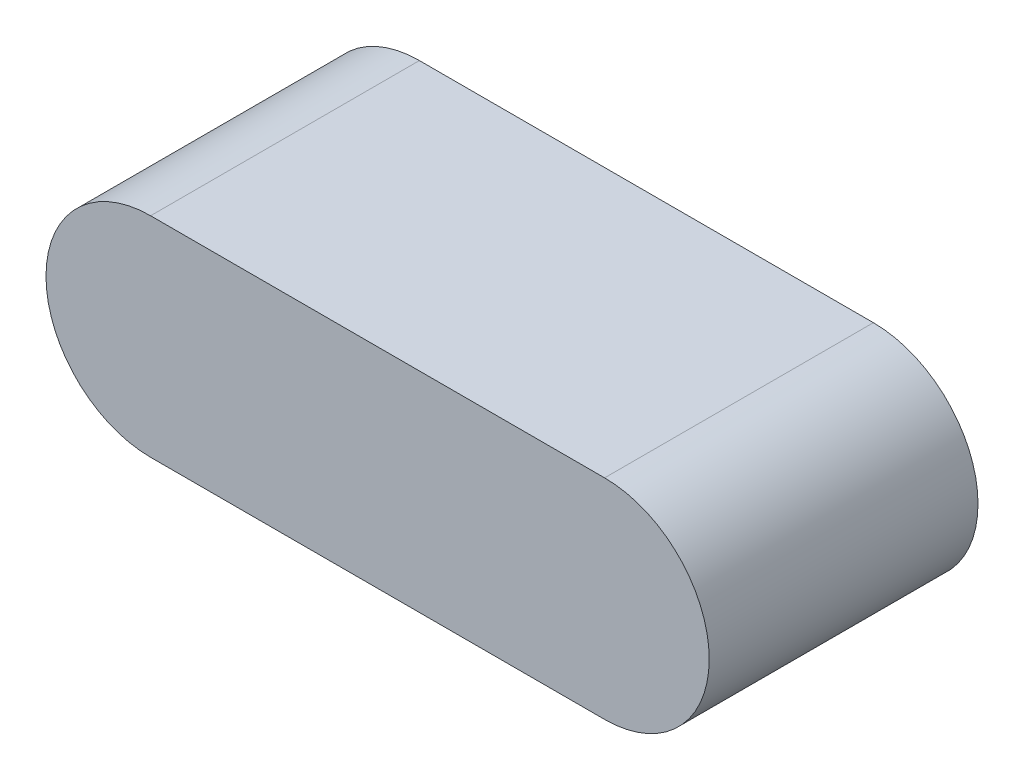
ISO-10303-21;
HEADER;
FILE_DESCRIPTION(('STEP AP214'),'2;1');
FILE_NAME('part.step','',(''),(''),'','','');
FILE_SCHEMA(('AUTOMOTIVE_DESIGN { 1 0 10303 214 1 1 1 1 }'));
ENDSEC;
DATA;
#1=APPLICATION_CONTEXT('core data for automotive mechanical design processes');
#2=APPLICATION_PROTOCOL_DEFINITION('international standard','automotive_design',2000,#1);
#3=PRODUCT_CONTEXT('',#1,'mechanical');
#4=PRODUCT('Part','Part','',(#3));
#5=PRODUCT_RELATED_PRODUCT_CATEGORY('part','',(#4));
#6=PRODUCT_DEFINITION_FORMATION('','',#4);
#7=PRODUCT_DEFINITION_CONTEXT('part definition',#1,'design');
#8=PRODUCT_DEFINITION('design','',#6,#7);
#9=PRODUCT_DEFINITION_SHAPE('','',#8);
#10=(LENGTH_UNIT() NAMED_UNIT(*) SI_UNIT(.MILLI.,.METRE.));
#11=(NAMED_UNIT(*) PLANE_ANGLE_UNIT() SI_UNIT($,.RADIAN.));
#12=(NAMED_UNIT(*) SI_UNIT($,.STERADIAN.) SOLID_ANGLE_UNIT());
#13=UNCERTAINTY_MEASURE_WITH_UNIT(LENGTH_MEASURE(1.E-05),#10,'distance_accuracy_value','');
#14=(GEOMETRIC_REPRESENTATION_CONTEXT(3) GLOBAL_UNCERTAINTY_ASSIGNED_CONTEXT((#13)) GLOBAL_UNIT_ASSIGNED_CONTEXT((#10,
#11,#12)) REPRESENTATION_CONTEXT('',''));
#15=CARTESIAN_POINT('',(0.,0.,0.));
#16=DIRECTION('',(0.,0.,1.));
#17=DIRECTION('',(1.,0.,0.));
#18=AXIS2_PLACEMENT_3D('',#15,#16,#17);
#19=CARTESIAN_POINT('',(0.,0.,0.));
#20=DIRECTION('',(0.,0.,1.));
#21=DIRECTION('',(1.,0.,0.));
#22=AXIS2_PLACEMENT_3D('',#19,#20,#21);
#23=CYLINDRICAL_SURFACE('',#22,19.4582763337893);
#24=DIRECTION('',(0.,0.,1.));
#25=VECTOR('',#24,1.);
#26=CARTESIAN_POINT('',(0.,-19.4582763337893,0.));
#27=LINE('',#26,#25);
#28=CARTESIAN_POINT('',(0.,-19.4582763337893,0.));
#29=VERTEX_POINT('',#28);
#30=CARTESIAN_POINT('',(0.,-19.4582763337893,50.));
#31=VERTEX_POINT('',#30);
#32=EDGE_CURVE('E42',#29,#31,#27,.T.);
#33=ORIENTED_EDGE('',*,*,#32,.T.);
#34=CARTESIAN_POINT('',(0.,0.,50.));
#35=DIRECTION('',(0.,0.,1.));
#36=DIRECTION('',(1.,0.,0.));
#37=AXIS2_PLACEMENT_3D('',#34,#35,#36);
#38=CIRCLE('',#37,19.4582763337893);
#39=CARTESIAN_POINT('',(0.,19.4582763337893,50.));
#40=VERTEX_POINT('',#39);
#41=EDGE_CURVE('E85',#40,#31,#38,.T.);
#42=ORIENTED_EDGE('',*,*,#41,.F.);
#43=DIRECTION('',(0.,0.,1.));
#44=VECTOR('',#43,1.);
#45=CARTESIAN_POINT('',(0.,19.4582763337893,0.));
#46=LINE('',#45,#44);
#47=CARTESIAN_POINT('',(0.,19.4582763337893,0.));
#48=VERTEX_POINT('',#47);
#49=EDGE_CURVE('E11',#48,#40,#46,.T.);
#50=ORIENTED_EDGE('',*,*,#49,.F.);
#51=CARTESIAN_POINT('',(0.,0.,0.));
#52=DIRECTION('',(0.,0.,1.));
#53=DIRECTION('',(1.,0.,0.));
#54=AXIS2_PLACEMENT_3D('',#51,#52,#53);
#55=CIRCLE('',#54,19.4582763337893);
#56=EDGE_CURVE('E102',#48,#29,#55,.T.);
#57=ORIENTED_EDGE('',*,*,#56,.T.);
#58=EDGE_LOOP('',(#33,#42,#50,#57));
#59=FACE_BOUND('',#58,.T.);
#60=ADVANCED_FACE('F39',(#59),#23,.T.);
#61=CARTESIAN_POINT('',(0.,19.4582763337893,0.));
#62=DIRECTION('',(0.,1.,0.));
#63=DIRECTION('',(0.,0.,1.));
#64=AXIS2_PLACEMENT_3D('',#61,#62,#63);
#65=PLANE('',#64);
#66=ORIENTED_EDGE('',*,*,#49,.T.);
#67=DIRECTION('',(-1.,0.,0.));
#68=VECTOR('',#67,1.);
#69=CARTESIAN_POINT('',(84.4515666731809,19.4582763337893,50.));
#70=LINE('',#69,#68);
#71=CARTESIAN_POINT('',(84.4515666731809,19.4582763337893,50.));
#72=VERTEX_POINT('',#71);
#73=EDGE_CURVE('E80',#72,#40,#70,.T.);
#74=ORIENTED_EDGE('',*,*,#73,.F.);
#75=DIRECTION('',(0.,0.,1.));
#76=VECTOR('',#75,1.);
#77=CARTESIAN_POINT('',(84.4515666731809,19.4582763337893,0.));
#78=LINE('',#77,#76);
#79=CARTESIAN_POINT('',(84.4515666731809,19.4582763337893,0.));
#80=VERTEX_POINT('',#79);
#81=EDGE_CURVE('E48',#80,#72,#78,.T.);
#82=ORIENTED_EDGE('',*,*,#81,.F.);
#83=DIRECTION('',(-1.,0.,0.));
#84=VECTOR('',#83,1.);
#85=CARTESIAN_POINT('',(0.,19.4582763337893,0.));
#86=LINE('',#85,#84);
#87=EDGE_CURVE('E83',#80,#48,#86,.T.);
#88=ORIENTED_EDGE('',*,*,#87,.T.);
#89=EDGE_LOOP('',(#66,#74,#82,#88));
#90=FACE_BOUND('',#89,.T.);
#91=ADVANCED_FACE('F78',(#90),#65,.T.);
#92=CARTESIAN_POINT('',(84.4515666731809,0.,0.));
#93=DIRECTION('',(0.,0.,1.));
#94=DIRECTION('',(1.,0.,0.));
#95=AXIS2_PLACEMENT_3D('',#92,#93,#94);
#96=CYLINDRICAL_SURFACE('',#95,19.4582763337893);
#97=ORIENTED_EDGE('',*,*,#81,.T.);
#98=CARTESIAN_POINT('',(84.4515666731809,0.,50.));
#99=DIRECTION('',(0.,0.,1.));
#100=DIRECTION('',(1.,0.,0.));
#101=AXIS2_PLACEMENT_3D('',#98,#99,#100);
#102=CIRCLE('',#101,19.4582763337893);
#103=CARTESIAN_POINT('',(84.4515666731809,-19.4582763337893,50.));
#104=VERTEX_POINT('',#103);
#105=EDGE_CURVE('E94',#104,#72,#102,.T.);
#106=ORIENTED_EDGE('',*,*,#105,.F.);
#107=DIRECTION('',(0.,0.,1.));
#108=VECTOR('',#107,1.);
#109=CARTESIAN_POINT('',(84.4515666731809,-19.4582763337893,0.));
#110=LINE('',#109,#108);
#111=CARTESIAN_POINT('',(84.4515666731809,-19.4582763337893,0.));
#112=VERTEX_POINT('',#111);
#113=EDGE_CURVE('E115',#112,#104,#110,.T.);
#114=ORIENTED_EDGE('',*,*,#113,.F.);
#115=CARTESIAN_POINT('',(84.4515666731809,0.,0.));
#116=DIRECTION('',(0.,0.,1.));
#117=DIRECTION('',(1.,0.,0.));
#118=AXIS2_PLACEMENT_3D('',#115,#116,#117);
#119=CIRCLE('',#118,19.4582763337893);
#120=EDGE_CURVE('E109',#112,#80,#119,.T.);
#121=ORIENTED_EDGE('',*,*,#120,.T.);
#122=EDGE_LOOP('',(#97,#106,#114,#121));
#123=FACE_BOUND('',#122,.T.);
#124=ADVANCED_FACE('F123',(#123),#96,.T.);
#125=CARTESIAN_POINT('',(0.,-19.4582763337893,0.));
#126=DIRECTION('',(0.,-1.,0.));
#127=DIRECTION('',(0.,0.,-1.));
#128=AXIS2_PLACEMENT_3D('',#125,#126,#127);
#129=PLANE('',#128);
#130=ORIENTED_EDGE('',*,*,#113,.T.);
#131=DIRECTION('',(1.,0.,0.));
#132=VECTOR('',#131,1.);
#133=CARTESIAN_POINT('',(0.,-19.4582763337893,50.));
#134=LINE('',#133,#132);
#135=EDGE_CURVE('E90',#31,#104,#134,.T.);
#136=ORIENTED_EDGE('',*,*,#135,.F.);
#137=ORIENTED_EDGE('',*,*,#32,.F.);
#138=DIRECTION('',(1.,0.,0.));
#139=VECTOR('',#138,1.);
#140=CARTESIAN_POINT('',(0.,-19.4582763337893,0.));
#141=LINE('',#140,#139);
#142=EDGE_CURVE('E105',#29,#112,#141,.T.);
#143=ORIENTED_EDGE('',*,*,#142,.T.);
#144=EDGE_LOOP('',(#130,#136,#137,#143));
#145=FACE_BOUND('',#144,.T.);
#146=ADVANCED_FACE('F119',(#145),#129,.T.);
#147=CARTESIAN_POINT('',(0.,0.,0.));
#148=DIRECTION('',(0.,0.,1.));
#149=DIRECTION('',(1.,0.,0.));
#150=AXIS2_PLACEMENT_3D('',#147,#148,#149);
#151=PLANE('',#150);
#152=ORIENTED_EDGE('',*,*,#56,.F.);
#153=ORIENTED_EDGE('',*,*,#87,.F.);
#154=ORIENTED_EDGE('',*,*,#120,.F.);
#155=ORIENTED_EDGE('',*,*,#142,.F.);
#156=EDGE_LOOP('',(#152,#153,#154,#155));
#157=FACE_BOUND('',#156,.T.);
#158=ADVANCED_FACE('F125',(#157),#151,.F.);
#159=CARTESIAN_POINT('',(0.,0.,50.));
#160=DIRECTION('',(0.,0.,1.));
#161=DIRECTION('',(1.,0.,0.));
#162=AXIS2_PLACEMENT_3D('',#159,#160,#161);
#163=PLANE('',#162);
#164=ORIENTED_EDGE('',*,*,#73,.T.);
#165=ORIENTED_EDGE('',*,*,#41,.T.);
#166=ORIENTED_EDGE('',*,*,#135,.T.);
#167=ORIENTED_EDGE('',*,*,#105,.T.);
#168=EDGE_LOOP('',(#164,#165,#166,#167));
#169=FACE_BOUND('',#168,.T.);
#170=ADVANCED_FACE('F92',(#169),#163,.T.);
#171=CLOSED_SHELL('',(#60,#91,#124,#146,#158,#170));
#172=MANIFOLD_SOLID_BREP('B2',#171);
#173=ADVANCED_BREP_SHAPE_REPRESENTATION('',(#18,#172),#14);
#174=SHAPE_DEFINITION_REPRESENTATION(#9,#173);
ENDSEC;
END-ISO-10303-21;
